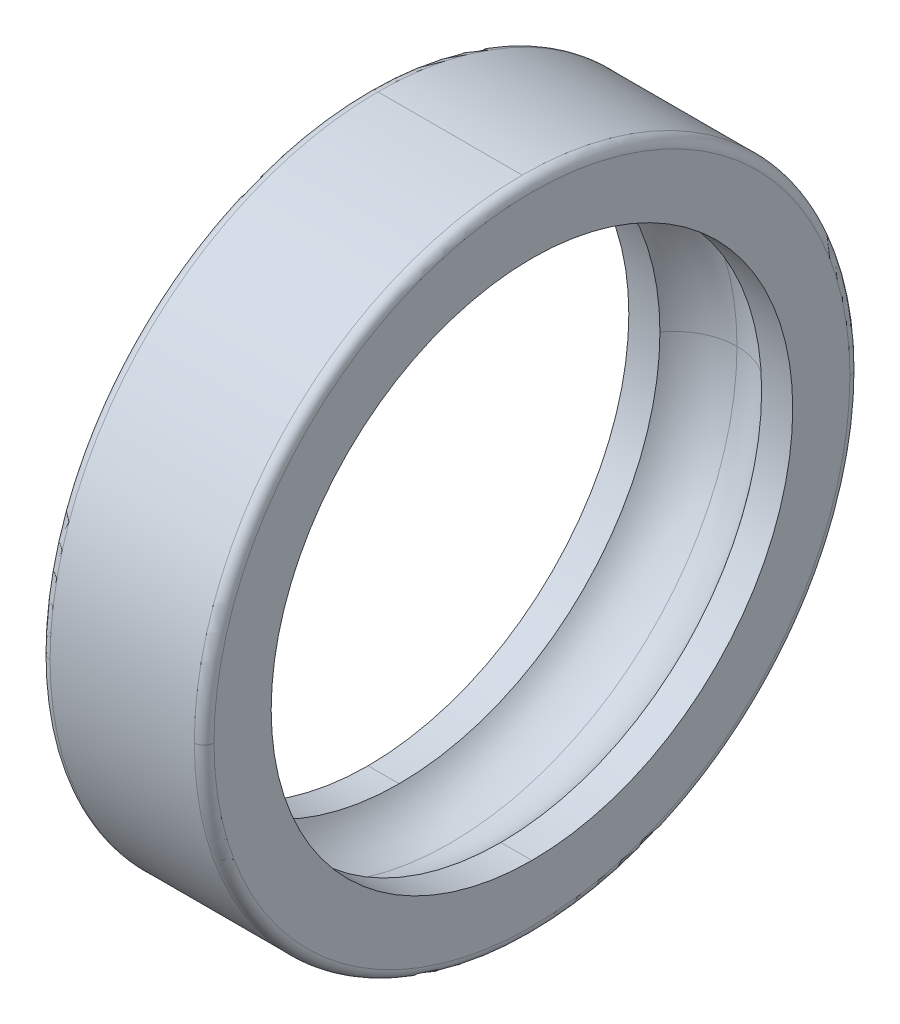
ISO-10303-21;
HEADER;
FILE_DESCRIPTION(('STEP AP214'),'2;1');
FILE_NAME('part.step','',(''),(''),'','','');
FILE_SCHEMA(('AUTOMOTIVE_DESIGN { 1 0 10303 214 1 1 1 1 }'));
ENDSEC;
DATA;
#1=APPLICATION_CONTEXT('core data for automotive mechanical design processes');
#2=APPLICATION_PROTOCOL_DEFINITION('international standard','automotive_design',2000,#1);
#3=PRODUCT_CONTEXT('',#1,'mechanical');
#4=PRODUCT('Part','Part','',(#3));
#5=PRODUCT_RELATED_PRODUCT_CATEGORY('part','',(#4));
#6=PRODUCT_DEFINITION_FORMATION('','',#4);
#7=PRODUCT_DEFINITION_CONTEXT('part definition',#1,'design');
#8=PRODUCT_DEFINITION('design','',#6,#7);
#9=PRODUCT_DEFINITION_SHAPE('','',#8);
#10=(LENGTH_UNIT() NAMED_UNIT(*) SI_UNIT(.MILLI.,.METRE.));
#11=(NAMED_UNIT(*) PLANE_ANGLE_UNIT() SI_UNIT($,.RADIAN.));
#12=(NAMED_UNIT(*) SI_UNIT($,.STERADIAN.) SOLID_ANGLE_UNIT());
#13=UNCERTAINTY_MEASURE_WITH_UNIT(LENGTH_MEASURE(1.E-05),#10,'distance_accuracy_value','');
#14=(GEOMETRIC_REPRESENTATION_CONTEXT(3) GLOBAL_UNCERTAINTY_ASSIGNED_CONTEXT((#13)) GLOBAL_UNIT_ASSIGNED_CONTEXT((#10,
#11,#12)) REPRESENTATION_CONTEXT('',''));
#15=CARTESIAN_POINT('',(0.,0.,0.));
#16=DIRECTION('',(0.,0.,1.));
#17=DIRECTION('',(1.,0.,0.));
#18=AXIS2_PLACEMENT_3D('',#15,#16,#17);
#19=CARTESIAN_POINT('',(22.6283643781883,0.,0.));
#20=DIRECTION('',(1.,0.,0.));
#21=DIRECTION('',(0.,1.,0.));
#22=AXIS2_PLACEMENT_3D('',#19,#20,#21);
#23=CYLINDRICAL_SURFACE('',#22,39.775);
#24=DIRECTION('',(1.,0.,0.));
#25=VECTOR('',#24,1.);
#26=CARTESIAN_POINT('',(22.6283643781883,39.775,0.));
#27=LINE('',#26,#25);
#28=CARTESIAN_POINT('',(20.2567287563766,39.775,0.));
#29=VERTEX_POINT('',#28);
#30=CARTESIAN_POINT('',(25.,39.775,0.));
#31=VERTEX_POINT('',#30);
#32=EDGE_CURVE('E197',#29,#31,#27,.T.);
#33=ORIENTED_EDGE('',*,*,#32,.T.);
#34=CARTESIAN_POINT('',(25.,0.,0.));
#35=DIRECTION('',(1.,0.,0.));
#36=DIRECTION('',(0.,1.,0.));
#37=AXIS2_PLACEMENT_3D('',#34,#35,#36);
#38=CIRCLE('',#37,39.775);
#39=CARTESIAN_POINT('',(25.,-39.775,0.));
#40=VERTEX_POINT('',#39);
#41=EDGE_CURVE('E10',#31,#40,#38,.T.);
#42=ORIENTED_EDGE('',*,*,#41,.T.);
#43=DIRECTION('',(-1.,0.,0.));
#44=VECTOR('',#43,1.);
#45=CARTESIAN_POINT('',(22.6283643781883,-39.775,0.));
#46=LINE('',#45,#44);
#47=CARTESIAN_POINT('',(20.2567287563766,-39.775,0.));
#48=VERTEX_POINT('',#47);
#49=EDGE_CURVE('E136',#40,#48,#46,.T.);
#50=ORIENTED_EDGE('',*,*,#49,.T.);
#51=CARTESIAN_POINT('',(20.2567287563766,0.,0.));
#52=DIRECTION('',(1.,0.,0.));
#53=DIRECTION('',(0.,1.,0.));
#54=AXIS2_PLACEMENT_3D('',#51,#52,#53);
#55=CIRCLE('',#54,39.775);
#56=CARTESIAN_POINT('',(20.2567287563766,0.,39.775));
#57=VERTEX_POINT('',#56);
#58=EDGE_CURVE('E195',#57,#48,#55,.T.);
#59=ORIENTED_EDGE('',*,*,#58,.F.);
#60=CARTESIAN_POINT('',(20.2567287563766,0.,0.));
#61=DIRECTION('',(1.,0.,0.));
#62=DIRECTION('',(0.,1.,0.));
#63=AXIS2_PLACEMENT_3D('',#60,#61,#62);
#64=CIRCLE('',#63,39.775);
#65=EDGE_CURVE('E212',#29,#57,#64,.T.);
#66=ORIENTED_EDGE('',*,*,#65,.F.);
#67=EDGE_LOOP('',(#33,#42,#50,#59,#66));
#68=FACE_BOUND('',#67,.T.);
#69=ADVANCED_FACE('F15',(#68),#23,.F.);
#70=CARTESIAN_POINT('',(25.,44.1375,0.));
#71=DIRECTION('',(1.,0.,0.));
#72=DIRECTION('',(0.,1.,0.));
#73=AXIS2_PLACEMENT_3D('',#70,#71,#72);
#74=PLANE('',#73);
#75=ORIENTED_EDGE('',*,*,#41,.F.);
#76=CARTESIAN_POINT('',(25.,0.,0.));
#77=DIRECTION('',(1.,0.,0.));
#78=DIRECTION('',(0.,1.,0.));
#79=AXIS2_PLACEMENT_3D('',#76,#77,#78);
#80=CIRCLE('',#79,39.775);
#81=EDGE_CURVE('E131',#40,#31,#80,.T.);
#82=ORIENTED_EDGE('',*,*,#81,.F.);
#83=EDGE_LOOP('',(#75,#82));
#84=FACE_BOUND('',#83,.T.);
#85=CARTESIAN_POINT('',(25.,0.,0.));
#86=DIRECTION('',(1.,0.,0.));
#87=DIRECTION('',(0.,1.,0.));
#88=AXIS2_PLACEMENT_3D('',#85,#86,#87);
#89=CIRCLE('',#88,48.5);
#90=CARTESIAN_POINT('',(25.,0.,48.5));
#91=VERTEX_POINT('',#90);
#92=CARTESIAN_POINT('',(25.,0.,-48.5));
#93=VERTEX_POINT('',#92);
#94=EDGE_CURVE('E19',#91,#93,#89,.T.);
#95=ORIENTED_EDGE('',*,*,#94,.T.);
#96=CARTESIAN_POINT('',(25.,0.,0.));
#97=DIRECTION('',(1.,0.,0.));
#98=DIRECTION('',(0.,1.,0.));
#99=AXIS2_PLACEMENT_3D('',#96,#97,#98);
#100=CIRCLE('',#99,48.5);
#101=EDGE_CURVE('E112',#93,#91,#100,.T.);
#102=ORIENTED_EDGE('',*,*,#101,.T.);
#103=EDGE_LOOP('',(#95,#102));
#104=FACE_BOUND('',#103,.T.);
#105=ADVANCED_FACE('F111',(#84,#104),#74,.T.);
#106=CARTESIAN_POINT('',(23.5,0.,0.));
#107=DIRECTION('',(1.,0.,0.));
#108=DIRECTION('',(0.,0.,-1.));
#109=AXIS2_PLACEMENT_3D('',#106,#107,#108);
#110=TOROIDAL_SURFACE('',#109,48.5,1.5);
#111=CARTESIAN_POINT('',(23.5,0.,-48.5));
#112=DIRECTION('',(0.,-1.,0.));
#113=DIRECTION('',(0.,0.,-1.));
#114=AXIS2_PLACEMENT_3D('',#111,#112,#113);
#115=CIRCLE('',#114,1.5);
#116=CARTESIAN_POINT('',(23.5,0.,-50.));
#117=VERTEX_POINT('',#116);
#118=EDGE_CURVE('E122',#117,#93,#115,.T.);
#119=ORIENTED_EDGE('',*,*,#118,.T.);
#120=ORIENTED_EDGE('',*,*,#94,.F.);
#121=CARTESIAN_POINT('',(23.5,0.,48.5));
#122=DIRECTION('',(0.,-1.,0.));
#123=DIRECTION('',(0.,0.,1.));
#124=AXIS2_PLACEMENT_3D('',#121,#122,#123);
#125=CIRCLE('',#124,1.5);
#126=CARTESIAN_POINT('',(23.5,0.,50.));
#127=VERTEX_POINT('',#126);
#128=EDGE_CURVE('E124',#91,#127,#125,.T.);
#129=ORIENTED_EDGE('',*,*,#128,.T.);
#130=CARTESIAN_POINT('',(23.5,0.,0.));
#131=DIRECTION('',(1.,0.,0.));
#132=DIRECTION('',(0.,1.,0.));
#133=AXIS2_PLACEMENT_3D('',#130,#131,#132);
#134=CIRCLE('',#133,50.);
#135=CARTESIAN_POINT('',(23.5,-50.,0.));
#136=VERTEX_POINT('',#135);
#137=EDGE_CURVE('E152',#127,#136,#134,.T.);
#138=ORIENTED_EDGE('',*,*,#137,.T.);
#139=CARTESIAN_POINT('',(23.5,0.,0.));
#140=DIRECTION('',(1.,0.,0.));
#141=DIRECTION('',(0.,1.,0.));
#142=AXIS2_PLACEMENT_3D('',#139,#140,#141);
#143=CIRCLE('',#142,50.);
#144=EDGE_CURVE('E117',#136,#117,#143,.T.);
#145=ORIENTED_EDGE('',*,*,#144,.T.);
#146=EDGE_LOOP('',(#119,#120,#129,#138,#145));
#147=FACE_BOUND('',#146,.T.);
#148=ADVANCED_FACE('F127',(#147),#110,.T.);
#149=CARTESIAN_POINT('',(12.5,0.,0.));
#150=DIRECTION('',(1.,0.,0.));
#151=DIRECTION('',(0.,1.,0.));
#152=AXIS2_PLACEMENT_3D('',#149,#150,#151);
#153=CYLINDRICAL_SURFACE('',#152,50.);
#154=DIRECTION('',(1.,0.,0.));
#155=VECTOR('',#154,1.);
#156=CARTESIAN_POINT('',(12.5,50.,0.));
#157=LINE('',#156,#155);
#158=CARTESIAN_POINT('',(1.5,50.,0.));
#159=VERTEX_POINT('',#158);
#160=CARTESIAN_POINT('',(23.5,50.,0.));
#161=VERTEX_POINT('',#160);
#162=EDGE_CURVE('E125',#159,#161,#157,.T.);
#163=ORIENTED_EDGE('',*,*,#162,.T.);
#164=CARTESIAN_POINT('',(23.5,0.,0.));
#165=DIRECTION('',(1.,0.,0.));
#166=DIRECTION('',(0.,1.,0.));
#167=AXIS2_PLACEMENT_3D('',#164,#165,#166);
#168=CIRCLE('',#167,50.);
#169=EDGE_CURVE('E130',#117,#161,#168,.T.);
#170=ORIENTED_EDGE('',*,*,#169,.F.);
#171=ORIENTED_EDGE('',*,*,#144,.F.);
#172=DIRECTION('',(-1.,0.,0.));
#173=VECTOR('',#172,1.);
#174=CARTESIAN_POINT('',(12.5,-50.,0.));
#175=LINE('',#174,#173);
#176=CARTESIAN_POINT('',(1.5,-50.,0.));
#177=VERTEX_POINT('',#176);
#178=EDGE_CURVE('E149',#136,#177,#175,.T.);
#179=ORIENTED_EDGE('',*,*,#178,.T.);
#180=CARTESIAN_POINT('',(1.5,0.,0.));
#181=DIRECTION('',(1.,0.,0.));
#182=DIRECTION('',(0.,1.,0.));
#183=AXIS2_PLACEMENT_3D('',#180,#181,#182);
#184=CIRCLE('',#183,50.);
#185=CARTESIAN_POINT('',(1.5,0.,-50.));
#186=VERTEX_POINT('',#185);
#187=EDGE_CURVE('E187',#177,#186,#184,.T.);
#188=ORIENTED_EDGE('',*,*,#187,.T.);
#189=CARTESIAN_POINT('',(1.5,0.,0.));
#190=DIRECTION('',(1.,0.,0.));
#191=DIRECTION('',(0.,1.,0.));
#192=AXIS2_PLACEMENT_3D('',#189,#190,#191);
#193=CIRCLE('',#192,50.);
#194=EDGE_CURVE('E162',#186,#159,#193,.T.);
#195=ORIENTED_EDGE('',*,*,#194,.T.);
#196=EDGE_LOOP('',(#163,#170,#171,#179,#188,#195));
#197=FACE_BOUND('',#196,.T.);
#198=ADVANCED_FACE('F253',(#197),#153,.T.);
#199=CARTESIAN_POINT('',(1.5,0.,0.));
#200=DIRECTION('',(1.,0.,0.));
#201=DIRECTION('',(0.,0.,-1.));
#202=AXIS2_PLACEMENT_3D('',#199,#200,#201);
#203=TOROIDAL_SURFACE('',#202,48.5,1.5);
#204=CARTESIAN_POINT('',(1.5,0.,-48.5));
#205=DIRECTION('',(0.,-1.,0.));
#206=DIRECTION('',(0.,0.,-1.));
#207=AXIS2_PLACEMENT_3D('',#204,#205,#206);
#208=CIRCLE('',#207,1.5);
#209=CARTESIAN_POINT('',(0.,0.,-48.5));
#210=VERTEX_POINT('',#209);
#211=EDGE_CURVE('E154',#210,#186,#208,.T.);
#212=ORIENTED_EDGE('',*,*,#211,.T.);
#213=ORIENTED_EDGE('',*,*,#187,.F.);
#214=CARTESIAN_POINT('',(1.5,0.,0.));
#215=DIRECTION('',(1.,0.,0.));
#216=DIRECTION('',(0.,1.,0.));
#217=AXIS2_PLACEMENT_3D('',#214,#215,#216);
#218=CIRCLE('',#217,50.);
#219=CARTESIAN_POINT('',(1.5,0.,50.));
#220=VERTEX_POINT('',#219);
#221=EDGE_CURVE('E146',#220,#177,#218,.T.);
#222=ORIENTED_EDGE('',*,*,#221,.F.);
#223=CARTESIAN_POINT('',(1.5,0.,48.5));
#224=DIRECTION('',(0.,-1.,0.));
#225=DIRECTION('',(0.,0.,1.));
#226=AXIS2_PLACEMENT_3D('',#223,#224,#225);
#227=CIRCLE('',#226,1.5);
#228=CARTESIAN_POINT('',(0.,0.,48.5));
#229=VERTEX_POINT('',#228);
#230=EDGE_CURVE('E160',#220,#229,#227,.T.);
#231=ORIENTED_EDGE('',*,*,#230,.T.);
#232=CARTESIAN_POINT('',(0.,0.,0.));
#233=DIRECTION('',(1.,0.,0.));
#234=DIRECTION('',(0.,1.,0.));
#235=AXIS2_PLACEMENT_3D('',#232,#233,#234);
#236=CIRCLE('',#235,48.5);
#237=EDGE_CURVE('E186',#229,#210,#236,.T.);
#238=ORIENTED_EDGE('',*,*,#237,.T.);
#239=EDGE_LOOP('',(#212,#213,#222,#231,#238));
#240=FACE_BOUND('',#239,.T.);
#241=ADVANCED_FACE('F271',(#240),#203,.T.);
#242=CARTESIAN_POINT('',(0.,44.1375,0.));
#243=DIRECTION('',(-1.,0.,0.));
#244=DIRECTION('',(0.,0.,1.));
#245=AXIS2_PLACEMENT_3D('',#242,#243,#244);
#246=PLANE('',#245);
#247=CARTESIAN_POINT('',(0.,0.,0.));
#248=DIRECTION('',(1.,0.,0.));
#249=DIRECTION('',(0.,1.,0.));
#250=AXIS2_PLACEMENT_3D('',#247,#248,#249);
#251=CIRCLE('',#250,39.775);
#252=CARTESIAN_POINT('',(0.,39.775,0.));
#253=VERTEX_POINT('',#252);
#254=CARTESIAN_POINT('',(0.,-39.775,0.));
#255=VERTEX_POINT('',#254);
#256=EDGE_CURVE('E185',#253,#255,#251,.T.);
#257=ORIENTED_EDGE('',*,*,#256,.T.);
#258=CARTESIAN_POINT('',(0.,0.,0.));
#259=DIRECTION('',(1.,0.,0.));
#260=DIRECTION('',(0.,1.,0.));
#261=AXIS2_PLACEMENT_3D('',#258,#259,#260);
#262=CIRCLE('',#261,39.775);
#263=EDGE_CURVE('E167',#255,#253,#262,.T.);
#264=ORIENTED_EDGE('',*,*,#263,.T.);
#265=EDGE_LOOP('',(#257,#264));
#266=FACE_BOUND('',#265,.T.);
#267=CARTESIAN_POINT('',(0.,0.,0.));
#268=DIRECTION('',(1.,0.,0.));
#269=DIRECTION('',(0.,1.,0.));
#270=AXIS2_PLACEMENT_3D('',#267,#268,#269);
#271=CIRCLE('',#270,48.5);
#272=EDGE_CURVE('E157',#210,#229,#271,.T.);
#273=ORIENTED_EDGE('',*,*,#272,.F.);
#274=ORIENTED_EDGE('',*,*,#237,.F.);
#275=EDGE_LOOP('',(#273,#274));
#276=FACE_BOUND('',#275,.T.);
#277=ADVANCED_FACE('F232',(#266,#276),#246,.T.);
#278=CARTESIAN_POINT('',(2.37163562181169,0.,0.));
#279=DIRECTION('',(1.,0.,0.));
#280=DIRECTION('',(0.,1.,0.));
#281=AXIS2_PLACEMENT_3D('',#278,#279,#280);
#282=CYLINDRICAL_SURFACE('',#281,39.775);
#283=DIRECTION('',(1.,0.,0.));
#284=VECTOR('',#283,1.);
#285=CARTESIAN_POINT('',(2.37163562181169,39.775,0.));
#286=LINE('',#285,#284);
#287=CARTESIAN_POINT('',(4.74327124362338,39.775,0.));
#288=VERTEX_POINT('',#287);
#289=EDGE_CURVE('E165',#253,#288,#286,.T.);
#290=ORIENTED_EDGE('',*,*,#289,.T.);
#291=CARTESIAN_POINT('',(4.74327124362338,0.,0.));
#292=DIRECTION('',(1.,0.,0.));
#293=DIRECTION('',(0.,1.,0.));
#294=AXIS2_PLACEMENT_3D('',#291,#292,#293);
#295=CIRCLE('',#294,39.775);
#296=CARTESIAN_POINT('',(4.74327124362338,0.,39.775));
#297=VERTEX_POINT('',#296);
#298=EDGE_CURVE('E31',#288,#297,#295,.T.);
#299=ORIENTED_EDGE('',*,*,#298,.T.);
#300=CARTESIAN_POINT('',(4.74327124362338,0.,0.));
#301=DIRECTION('',(1.,0.,0.));
#302=DIRECTION('',(0.,1.,0.));
#303=AXIS2_PLACEMENT_3D('',#300,#301,#302);
#304=CIRCLE('',#303,39.775);
#305=CARTESIAN_POINT('',(4.74327124362338,-39.775,0.));
#306=VERTEX_POINT('',#305);
#307=EDGE_CURVE('E180',#297,#306,#304,.T.);
#308=ORIENTED_EDGE('',*,*,#307,.T.);
#309=DIRECTION('',(-1.,0.,0.));
#310=VECTOR('',#309,1.);
#311=CARTESIAN_POINT('',(2.37163562181169,-39.775,0.));
#312=LINE('',#311,#310);
#313=EDGE_CURVE('E170',#306,#255,#312,.T.);
#314=ORIENTED_EDGE('',*,*,#313,.T.);
#315=ORIENTED_EDGE('',*,*,#256,.F.);
#316=EDGE_LOOP('',(#290,#299,#308,#314,#315));
#317=FACE_BOUND('',#316,.T.);
#318=ADVANCED_FACE('F17',(#317),#282,.F.);
#319=CARTESIAN_POINT('',(12.5,0.,0.));
#320=DIRECTION('',(1.,0.,0.));
#321=DIRECTION('',(0.,0.,-1.));
#322=AXIS2_PLACEMENT_3D('',#319,#320,#321);
#323=TOROIDAL_SURFACE('',#322,34.247,9.525);
#324=CARTESIAN_POINT('',(12.5,0.,0.));
#325=DIRECTION('',(1.,0.,0.));
#326=DIRECTION('',(0.,0.,1.));
#327=AXIS2_PLACEMENT_3D('',#324,#325,#326);
#328=CIRCLE('',#327,43.772);
#329=CARTESIAN_POINT('',(12.5,0.,-43.772));
#330=VERTEX_POINT('',#329);
#331=CARTESIAN_POINT('',(12.5,0.,43.772));
#332=VERTEX_POINT('',#331);
#333=EDGE_CURVE('E221',#330,#332,#328,.T.);
#334=ORIENTED_EDGE('',*,*,#333,.T.);
#335=CARTESIAN_POINT('',(12.5,0.,34.247));
#336=DIRECTION('',(0.,-1.,0.));
#337=DIRECTION('',(0.,0.,1.));
#338=AXIS2_PLACEMENT_3D('',#335,#336,#337);
#339=CIRCLE('',#338,9.525);
#340=EDGE_CURVE('E182',#332,#297,#339,.T.);
#341=ORIENTED_EDGE('',*,*,#340,.T.);
#342=ORIENTED_EDGE('',*,*,#298,.F.);
#343=CARTESIAN_POINT('',(4.74327124362338,0.,0.));
#344=DIRECTION('',(1.,0.,0.));
#345=DIRECTION('',(0.,1.,0.));
#346=AXIS2_PLACEMENT_3D('',#343,#344,#345);
#347=CIRCLE('',#346,39.775);
#348=CARTESIAN_POINT('',(4.74327124362338,0.,-39.775));
#349=VERTEX_POINT('',#348);
#350=EDGE_CURVE('E176',#349,#288,#347,.T.);
#351=ORIENTED_EDGE('',*,*,#350,.F.);
#352=CARTESIAN_POINT('',(12.5,0.,-34.247));
#353=DIRECTION('',(0.,-1.,0.));
#354=DIRECTION('',(0.,0.,-1.));
#355=AXIS2_PLACEMENT_3D('',#352,#353,#354);
#356=CIRCLE('',#355,9.525);
#357=EDGE_CURVE('E39',#349,#330,#356,.T.);
#358=ORIENTED_EDGE('',*,*,#357,.T.);
#359=EDGE_LOOP('',(#334,#341,#342,#351,#358));
#360=FACE_BOUND('',#359,.T.);
#361=ADVANCED_FACE('F225',(#360),#323,.F.);
#362=CARTESIAN_POINT('',(12.5,0.,0.));
#363=DIRECTION('',(1.,0.,0.));
#364=DIRECTION('',(0.,0.,-1.));
#365=AXIS2_PLACEMENT_3D('',#362,#363,#364);
#366=TOROIDAL_SURFACE('',#365,34.247,9.525);
#367=CARTESIAN_POINT('',(12.5,0.,0.));
#368=DIRECTION('',(1.,0.,0.));
#369=DIRECTION('',(0.,0.,1.));
#370=AXIS2_PLACEMENT_3D('',#367,#368,#369);
#371=CIRCLE('',#370,43.772);
#372=EDGE_CURVE('E194',#332,#330,#371,.T.);
#373=ORIENTED_EDGE('',*,*,#372,.T.);
#374=ORIENTED_EDGE('',*,*,#357,.F.);
#375=CARTESIAN_POINT('',(4.74327124362338,0.,0.));
#376=DIRECTION('',(1.,0.,0.));
#377=DIRECTION('',(0.,1.,0.));
#378=AXIS2_PLACEMENT_3D('',#375,#376,#377);
#379=CIRCLE('',#378,39.775);
#380=EDGE_CURVE('E173',#306,#349,#379,.T.);
#381=ORIENTED_EDGE('',*,*,#380,.F.);
#382=ORIENTED_EDGE('',*,*,#307,.F.);
#383=ORIENTED_EDGE('',*,*,#340,.F.);
#384=EDGE_LOOP('',(#373,#374,#381,#382,#383));
#385=FACE_BOUND('',#384,.T.);
#386=ADVANCED_FACE('F239',(#385),#366,.F.);
#387=CARTESIAN_POINT('',(2.37163562181169,0.,0.));
#388=DIRECTION('',(1.,0.,0.));
#389=DIRECTION('',(0.,1.,0.));
#390=AXIS2_PLACEMENT_3D('',#387,#388,#389);
#391=CYLINDRICAL_SURFACE('',#390,39.775);
#392=ORIENTED_EDGE('',*,*,#289,.F.);
#393=ORIENTED_EDGE('',*,*,#263,.F.);
#394=ORIENTED_EDGE('',*,*,#313,.F.);
#395=ORIENTED_EDGE('',*,*,#380,.T.);
#396=ORIENTED_EDGE('',*,*,#350,.T.);
#397=EDGE_LOOP('',(#392,#393,#394,#395,#396));
#398=FACE_BOUND('',#397,.T.);
#399=ADVANCED_FACE('F238',(#398),#391,.F.);
#400=CARTESIAN_POINT('',(1.5,0.,0.));
#401=DIRECTION('',(1.,0.,0.));
#402=DIRECTION('',(0.,0.,-1.));
#403=AXIS2_PLACEMENT_3D('',#400,#401,#402);
#404=TOROIDAL_SURFACE('',#403,48.5,1.5);
#405=ORIENTED_EDGE('',*,*,#211,.F.);
#406=ORIENTED_EDGE('',*,*,#272,.T.);
#407=ORIENTED_EDGE('',*,*,#230,.F.);
#408=CARTESIAN_POINT('',(1.5,0.,0.));
#409=DIRECTION('',(1.,0.,0.));
#410=DIRECTION('',(0.,1.,0.));
#411=AXIS2_PLACEMENT_3D('',#408,#409,#410);
#412=CIRCLE('',#411,50.);
#413=EDGE_CURVE('E143',#159,#220,#412,.T.);
#414=ORIENTED_EDGE('',*,*,#413,.F.);
#415=ORIENTED_EDGE('',*,*,#194,.F.);
#416=EDGE_LOOP('',(#405,#406,#407,#414,#415));
#417=FACE_BOUND('',#416,.T.);
#418=ADVANCED_FACE('F262',(#417),#404,.T.);
#419=CARTESIAN_POINT('',(12.5,0.,0.));
#420=DIRECTION('',(1.,0.,0.));
#421=DIRECTION('',(0.,1.,0.));
#422=AXIS2_PLACEMENT_3D('',#419,#420,#421);
#423=CYLINDRICAL_SURFACE('',#422,50.);
#424=ORIENTED_EDGE('',*,*,#162,.F.);
#425=ORIENTED_EDGE('',*,*,#413,.T.);
#426=ORIENTED_EDGE('',*,*,#221,.T.);
#427=ORIENTED_EDGE('',*,*,#178,.F.);
#428=ORIENTED_EDGE('',*,*,#137,.F.);
#429=CARTESIAN_POINT('',(23.5,0.,0.));
#430=DIRECTION('',(1.,0.,0.));
#431=DIRECTION('',(0.,1.,0.));
#432=AXIS2_PLACEMENT_3D('',#429,#430,#431);
#433=CIRCLE('',#432,50.);
#434=EDGE_CURVE('E133',#161,#127,#433,.T.);
#435=ORIENTED_EDGE('',*,*,#434,.F.);
#436=EDGE_LOOP('',(#424,#425,#426,#427,#428,#435));
#437=FACE_BOUND('',#436,.T.);
#438=ADVANCED_FACE('F259',(#437),#423,.T.);
#439=CARTESIAN_POINT('',(23.5,0.,0.));
#440=DIRECTION('',(1.,0.,0.));
#441=DIRECTION('',(0.,0.,-1.));
#442=AXIS2_PLACEMENT_3D('',#439,#440,#441);
#443=TOROIDAL_SURFACE('',#442,48.5,1.5);
#444=ORIENTED_EDGE('',*,*,#118,.F.);
#445=ORIENTED_EDGE('',*,*,#169,.T.);
#446=ORIENTED_EDGE('',*,*,#434,.T.);
#447=ORIENTED_EDGE('',*,*,#128,.F.);
#448=ORIENTED_EDGE('',*,*,#101,.F.);
#449=EDGE_LOOP('',(#444,#445,#446,#447,#448));
#450=FACE_BOUND('',#449,.T.);
#451=ADVANCED_FACE('F120',(#450),#443,.T.);
#452=CARTESIAN_POINT('',(22.6283643781883,0.,0.));
#453=DIRECTION('',(1.,0.,0.));
#454=DIRECTION('',(0.,1.,0.));
#455=AXIS2_PLACEMENT_3D('',#452,#453,#454);
#456=CYLINDRICAL_SURFACE('',#455,39.775);
#457=ORIENTED_EDGE('',*,*,#32,.F.);
#458=CARTESIAN_POINT('',(20.2567287563766,0.,0.));
#459=DIRECTION('',(1.,0.,0.));
#460=DIRECTION('',(0.,1.,0.));
#461=AXIS2_PLACEMENT_3D('',#458,#459,#460);
#462=CIRCLE('',#461,39.775);
#463=CARTESIAN_POINT('',(20.2567287563766,0.,-39.775));
#464=VERTEX_POINT('',#463);
#465=EDGE_CURVE('E211',#464,#29,#462,.T.);
#466=ORIENTED_EDGE('',*,*,#465,.F.);
#467=CARTESIAN_POINT('',(20.2567287563766,0.,0.));
#468=DIRECTION('',(1.,0.,0.));
#469=DIRECTION('',(0.,1.,0.));
#470=AXIS2_PLACEMENT_3D('',#467,#468,#469);
#471=CIRCLE('',#470,39.775);
#472=EDGE_CURVE('E199',#48,#464,#471,.T.);
#473=ORIENTED_EDGE('',*,*,#472,.F.);
#474=ORIENTED_EDGE('',*,*,#49,.F.);
#475=ORIENTED_EDGE('',*,*,#81,.T.);
#476=EDGE_LOOP('',(#457,#466,#473,#474,#475));
#477=FACE_BOUND('',#476,.T.);
#478=ADVANCED_FACE('F242',(#477),#456,.F.);
#479=CARTESIAN_POINT('',(12.5,0.,0.));
#480=DIRECTION('',(1.,0.,0.));
#481=DIRECTION('',(0.,0.,-1.));
#482=AXIS2_PLACEMENT_3D('',#479,#480,#481);
#483=TOROIDAL_SURFACE('',#482,34.247,9.525);
#484=ORIENTED_EDGE('',*,*,#372,.F.);
#485=CARTESIAN_POINT('',(12.5,0.,34.247));
#486=DIRECTION('',(0.,-1.,0.));
#487=DIRECTION('',(0.,0.,1.));
#488=AXIS2_PLACEMENT_3D('',#485,#486,#487);
#489=CIRCLE('',#488,9.525);
#490=EDGE_CURVE('E196',#57,#332,#489,.T.);
#491=ORIENTED_EDGE('',*,*,#490,.F.);
#492=ORIENTED_EDGE('',*,*,#58,.T.);
#493=ORIENTED_EDGE('',*,*,#472,.T.);
#494=CARTESIAN_POINT('',(12.5,0.,-34.247));
#495=DIRECTION('',(0.,-1.,0.));
#496=DIRECTION('',(0.,0.,-1.));
#497=AXIS2_PLACEMENT_3D('',#494,#495,#496);
#498=CIRCLE('',#497,9.525);
#499=EDGE_CURVE('E227',#330,#464,#498,.T.);
#500=ORIENTED_EDGE('',*,*,#499,.F.);
#501=EDGE_LOOP('',(#484,#491,#492,#493,#500));
#502=FACE_BOUND('',#501,.T.);
#503=ADVANCED_FACE('F240',(#502),#483,.F.);
#504=CARTESIAN_POINT('',(12.5,0.,0.));
#505=DIRECTION('',(1.,0.,0.));
#506=DIRECTION('',(0.,0.,-1.));
#507=AXIS2_PLACEMENT_3D('',#504,#505,#506);
#508=TOROIDAL_SURFACE('',#507,34.247,9.525);
#509=ORIENTED_EDGE('',*,*,#333,.F.);
#510=ORIENTED_EDGE('',*,*,#499,.T.);
#511=ORIENTED_EDGE('',*,*,#465,.T.);
#512=ORIENTED_EDGE('',*,*,#65,.T.);
#513=ORIENTED_EDGE('',*,*,#490,.T.);
#514=EDGE_LOOP('',(#509,#510,#511,#512,#513));
#515=FACE_BOUND('',#514,.T.);
#516=ADVANCED_FACE('F219',(#515),#508,.F.);
#517=CLOSED_SHELL('',(#69,#105,#148,#198,#241,#277,#318,#361,#386,#399,#418,#438,#451,#478,#503,#516));
#518=MANIFOLD_SOLID_BREP('B1',#517);
#519=ADVANCED_BREP_SHAPE_REPRESENTATION('',(#18,#518),#14);
#520=SHAPE_DEFINITION_REPRESENTATION(#9,#519);
ENDSEC;
END-ISO-10303-21;
